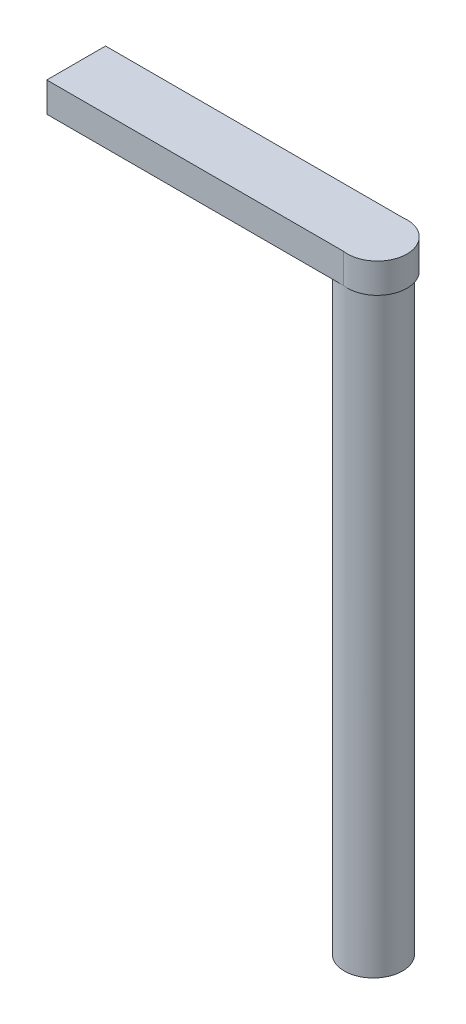
ISO-10303-21;
HEADER;
FILE_DESCRIPTION(('STEP AP214'),'2;1');
FILE_NAME('part.step','',(''),(''),'','','');
FILE_SCHEMA(('AUTOMOTIVE_DESIGN { 1 0 10303 214 1 1 1 1 }'));
ENDSEC;
DATA;
#1=APPLICATION_CONTEXT('core data for automotive mechanical design processes');
#2=APPLICATION_PROTOCOL_DEFINITION('international standard','automotive_design',2000,#1);
#3=PRODUCT_CONTEXT('',#1,'mechanical');
#4=PRODUCT('Part','Part','',(#3));
#5=PRODUCT_RELATED_PRODUCT_CATEGORY('part','',(#4));
#6=PRODUCT_DEFINITION_FORMATION('','',#4);
#7=PRODUCT_DEFINITION_CONTEXT('part definition',#1,'design');
#8=PRODUCT_DEFINITION('design','',#6,#7);
#9=PRODUCT_DEFINITION_SHAPE('','',#8);
#10=(LENGTH_UNIT() NAMED_UNIT(*) SI_UNIT(.MILLI.,.METRE.));
#11=(NAMED_UNIT(*) PLANE_ANGLE_UNIT() SI_UNIT($,.RADIAN.));
#12=(NAMED_UNIT(*) SI_UNIT($,.STERADIAN.) SOLID_ANGLE_UNIT());
#13=UNCERTAINTY_MEASURE_WITH_UNIT(LENGTH_MEASURE(1.E-05),#10,'distance_accuracy_value','');
#14=(GEOMETRIC_REPRESENTATION_CONTEXT(3) GLOBAL_UNCERTAINTY_ASSIGNED_CONTEXT((#13)) GLOBAL_UNIT_ASSIGNED_CONTEXT((#10,
#11,#12)) REPRESENTATION_CONTEXT('',''));
#15=CARTESIAN_POINT('',(0.,0.,0.));
#16=DIRECTION('',(0.,0.,1.));
#17=DIRECTION('',(1.,0.,0.));
#18=AXIS2_PLACEMENT_3D('',#15,#16,#17);
#19=CARTESIAN_POINT('',(0.,100.,0.));
#20=DIRECTION('',(0.,-1.,0.));
#21=DIRECTION('',(0.,0.,-1.));
#22=AXIS2_PLACEMENT_3D('',#19,#20,#21);
#23=CYLINDRICAL_SURFACE('',#22,4.9);
#24=CARTESIAN_POINT('',(0.,100.,0.));
#25=DIRECTION('',(0.,1.,0.));
#26=DIRECTION('',(0.,0.,1.));
#27=AXIS2_PLACEMENT_3D('',#24,#25,#26);
#28=CIRCLE('',#27,4.9);
#29=CARTESIAN_POINT('',(0.,100.,-4.9));
#30=VERTEX_POINT('',#29);
#31=EDGE_CURVE('E11',#30,#30,#28,.T.);
#32=ORIENTED_EDGE('',*,*,#31,.F.);
#33=EDGE_LOOP('',(#32));
#34=FACE_BOUND('',#33,.T.);
#35=CARTESIAN_POINT('',(0.,0.,0.));
#36=DIRECTION('',(0.,1.,0.));
#37=DIRECTION('',(0.,0.,1.));
#38=AXIS2_PLACEMENT_3D('',#35,#36,#37);
#39=CIRCLE('',#38,4.9);
#40=CARTESIAN_POINT('',(0.,0.,4.9));
#41=VERTEX_POINT('',#40);
#42=EDGE_CURVE('E36',#41,#41,#39,.T.);
#43=ORIENTED_EDGE('',*,*,#42,.T.);
#44=EDGE_LOOP('',(#43));
#45=FACE_BOUND('',#44,.T.);
#46=ADVANCED_FACE('F33',(#34,#45),#23,.T.);
#47=CARTESIAN_POINT('',(0.,0.,0.));
#48=DIRECTION('',(0.,1.,0.));
#49=DIRECTION('',(0.,0.,1.));
#50=AXIS2_PLACEMENT_3D('',#47,#48,#49);
#51=PLANE('',#50);
#52=ORIENTED_EDGE('',*,*,#42,.F.);
#53=EDGE_LOOP('',(#52));
#54=FACE_BOUND('',#53,.T.);
#55=ADVANCED_FACE('F113',(#54),#51,.F.);
#56=CARTESIAN_POINT('',(0.705336798983298,100.,0.0499999999999984));
#57=DIRECTION('',(0.,1.,0.));
#58=DIRECTION('',(0.,0.,1.));
#59=AXIS2_PLACEMENT_3D('',#56,#57,#58);
#60=PLANE('',#59);
#61=DIRECTION('',(-1.,0.,0.));
#62=VECTOR('',#61,1.);
#63=CARTESIAN_POINT('',(0.,100.,-4.9));
#64=LINE('',#63,#62);
#65=CARTESIAN_POINT('',(-50.,100.,-4.9));
#66=VERTEX_POINT('',#65);
#67=EDGE_CURVE('E91',#30,#66,#64,.T.);
#68=ORIENTED_EDGE('',*,*,#67,.F.);
#69=ORIENTED_EDGE('',*,*,#31,.T.);
#70=CARTESIAN_POINT('',(0.705336798983298,100.,0.0499999999999984));
#71=DIRECTION('',(0.,1.,0.));
#72=DIRECTION('',(0.,0.,1.));
#73=AXIS2_PLACEMENT_3D('',#70,#71,#72);
#74=CIRCLE('',#73,5.);
#75=CARTESIAN_POINT('',(0.,100.,5.));
#76=VERTEX_POINT('',#75);
#77=EDGE_CURVE('E101',#76,#30,#74,.T.);
#78=ORIENTED_EDGE('',*,*,#77,.F.);
#79=DIRECTION('',(1.,0.,0.));
#80=VECTOR('',#79,1.);
#81=CARTESIAN_POINT('',(0.,100.,5.));
#82=LINE('',#81,#80);
#83=CARTESIAN_POINT('',(-50.,100.,5.00000000000001));
#84=VERTEX_POINT('',#83);
#85=EDGE_CURVE('E72',#84,#76,#82,.T.);
#86=ORIENTED_EDGE('',*,*,#85,.F.);
#87=DIRECTION('',(0.,0.,1.));
#88=VECTOR('',#87,1.);
#89=CARTESIAN_POINT('',(-50.,100.,-4.9));
#90=LINE('',#89,#88);
#91=EDGE_CURVE('E66',#66,#84,#90,.T.);
#92=ORIENTED_EDGE('',*,*,#91,.F.);
#93=EDGE_LOOP('',(#68,#69,#78,#86,#92));
#94=FACE_BOUND('',#93,.T.);
#95=ADVANCED_FACE('F115',(#94),#60,.F.);
#96=CARTESIAN_POINT('',(0.705336798983298,105.,0.0499999999999984));
#97=DIRECTION('',(0.,-1.,0.));
#98=DIRECTION('',(0.,0.,-1.));
#99=AXIS2_PLACEMENT_3D('',#96,#97,#98);
#100=CYLINDRICAL_SURFACE('',#99,5.);
#101=ORIENTED_EDGE('',*,*,#77,.T.);
#102=DIRECTION('',(0.,-1.,0.));
#103=VECTOR('',#102,1.);
#104=CARTESIAN_POINT('',(0.,105.,-4.9));
#105=LINE('',#104,#103);
#106=CARTESIAN_POINT('',(0.,105.,-4.9));
#107=VERTEX_POINT('',#106);
#108=EDGE_CURVE('E92',#107,#30,#105,.T.);
#109=ORIENTED_EDGE('',*,*,#108,.F.);
#110=CARTESIAN_POINT('',(0.705336798983298,105.,0.0499999999999984));
#111=DIRECTION('',(0.,1.,0.));
#112=DIRECTION('',(0.,0.,1.));
#113=AXIS2_PLACEMENT_3D('',#110,#111,#112);
#114=CIRCLE('',#113,5.);
#115=CARTESIAN_POINT('',(0.,105.,5.));
#116=VERTEX_POINT('',#115);
#117=EDGE_CURVE('E85',#116,#107,#114,.T.);
#118=ORIENTED_EDGE('',*,*,#117,.F.);
#119=DIRECTION('',(0.,-1.,0.));
#120=VECTOR('',#119,1.);
#121=CARTESIAN_POINT('',(0.,105.,5.));
#122=LINE('',#121,#120);
#123=EDGE_CURVE('E97',#116,#76,#122,.T.);
#124=ORIENTED_EDGE('',*,*,#123,.T.);
#125=EDGE_LOOP('',(#101,#109,#118,#124));
#126=FACE_BOUND('',#125,.T.);
#127=ADVANCED_FACE('F120',(#126),#100,.T.);
#128=CARTESIAN_POINT('',(0.,105.,-4.9));
#129=DIRECTION('',(0.,0.,1.));
#130=DIRECTION('',(1.,0.,0.));
#131=AXIS2_PLACEMENT_3D('',#128,#129,#130);
#132=PLANE('',#131);
#133=ORIENTED_EDGE('',*,*,#67,.T.);
#134=DIRECTION('',(0.,-1.,0.));
#135=VECTOR('',#134,1.);
#136=CARTESIAN_POINT('',(-50.,105.,-4.9));
#137=LINE('',#136,#135);
#138=CARTESIAN_POINT('',(-50.,105.,-4.9));
#139=VERTEX_POINT('',#138);
#140=EDGE_CURVE('E88',#139,#66,#137,.T.);
#141=ORIENTED_EDGE('',*,*,#140,.F.);
#142=DIRECTION('',(-1.,0.,0.));
#143=VECTOR('',#142,1.);
#144=CARTESIAN_POINT('',(0.,105.,-4.9));
#145=LINE('',#144,#143);
#146=EDGE_CURVE('E80',#107,#139,#145,.T.);
#147=ORIENTED_EDGE('',*,*,#146,.F.);
#148=ORIENTED_EDGE('',*,*,#108,.T.);
#149=EDGE_LOOP('',(#133,#141,#147,#148));
#150=FACE_BOUND('',#149,.T.);
#151=ADVANCED_FACE('F89',(#150),#132,.F.);
#152=CARTESIAN_POINT('',(-50.,105.,-4.9));
#153=DIRECTION('',(1.,0.,0.));
#154=DIRECTION('',(0.,0.,-1.));
#155=AXIS2_PLACEMENT_3D('',#152,#153,#154);
#156=PLANE('',#155);
#157=ORIENTED_EDGE('',*,*,#91,.T.);
#158=DIRECTION('',(0.,-1.,0.));
#159=VECTOR('',#158,1.);
#160=CARTESIAN_POINT('',(-50.,105.,5.00000000000001));
#161=LINE('',#160,#159);
#162=CARTESIAN_POINT('',(-50.,105.,5.00000000000001));
#163=VERTEX_POINT('',#162);
#164=EDGE_CURVE('E93',#163,#84,#161,.T.);
#165=ORIENTED_EDGE('',*,*,#164,.F.);
#166=DIRECTION('',(0.,0.,1.));
#167=VECTOR('',#166,1.);
#168=CARTESIAN_POINT('',(-50.,105.,-4.9));
#169=LINE('',#168,#167);
#170=EDGE_CURVE('E83',#139,#163,#169,.T.);
#171=ORIENTED_EDGE('',*,*,#170,.F.);
#172=ORIENTED_EDGE('',*,*,#140,.T.);
#173=EDGE_LOOP('',(#157,#165,#171,#172));
#174=FACE_BOUND('',#173,.T.);
#175=ADVANCED_FACE('F95',(#174),#156,.F.);
#176=CARTESIAN_POINT('',(0.,105.,5.));
#177=DIRECTION('',(0.,0.,-1.));
#178=DIRECTION('',(-1.,0.,0.));
#179=AXIS2_PLACEMENT_3D('',#176,#177,#178);
#180=PLANE('',#179);
#181=ORIENTED_EDGE('',*,*,#85,.T.);
#182=ORIENTED_EDGE('',*,*,#123,.F.);
#183=DIRECTION('',(1.,0.,0.));
#184=VECTOR('',#183,1.);
#185=CARTESIAN_POINT('',(0.,105.,5.));
#186=LINE('',#185,#184);
#187=EDGE_CURVE('E49',#163,#116,#186,.T.);
#188=ORIENTED_EDGE('',*,*,#187,.F.);
#189=ORIENTED_EDGE('',*,*,#164,.T.);
#190=EDGE_LOOP('',(#181,#182,#188,#189));
#191=FACE_BOUND('',#190,.T.);
#192=ADVANCED_FACE('F132',(#191),#180,.F.);
#193=CARTESIAN_POINT('',(0.705336798983298,105.,0.0499999999999984));
#194=DIRECTION('',(0.,1.,0.));
#195=DIRECTION('',(0.,0.,1.));
#196=AXIS2_PLACEMENT_3D('',#193,#194,#195);
#197=PLANE('',#196);
#198=ORIENTED_EDGE('',*,*,#117,.T.);
#199=ORIENTED_EDGE('',*,*,#146,.T.);
#200=ORIENTED_EDGE('',*,*,#170,.T.);
#201=ORIENTED_EDGE('',*,*,#187,.T.);
#202=EDGE_LOOP('',(#198,#199,#200,#201));
#203=FACE_BOUND('',#202,.T.);
#204=ADVANCED_FACE('F81',(#203),#197,.T.);
#205=CLOSED_SHELL('',(#46,#55,#95,#127,#151,#175,#192,#204));
#206=MANIFOLD_SOLID_BREP('B2',#205);
#207=ADVANCED_BREP_SHAPE_REPRESENTATION('',(#18,#206),#14);
#208=SHAPE_DEFINITION_REPRESENTATION(#9,#207);
ENDSEC;
END-ISO-10303-21;
